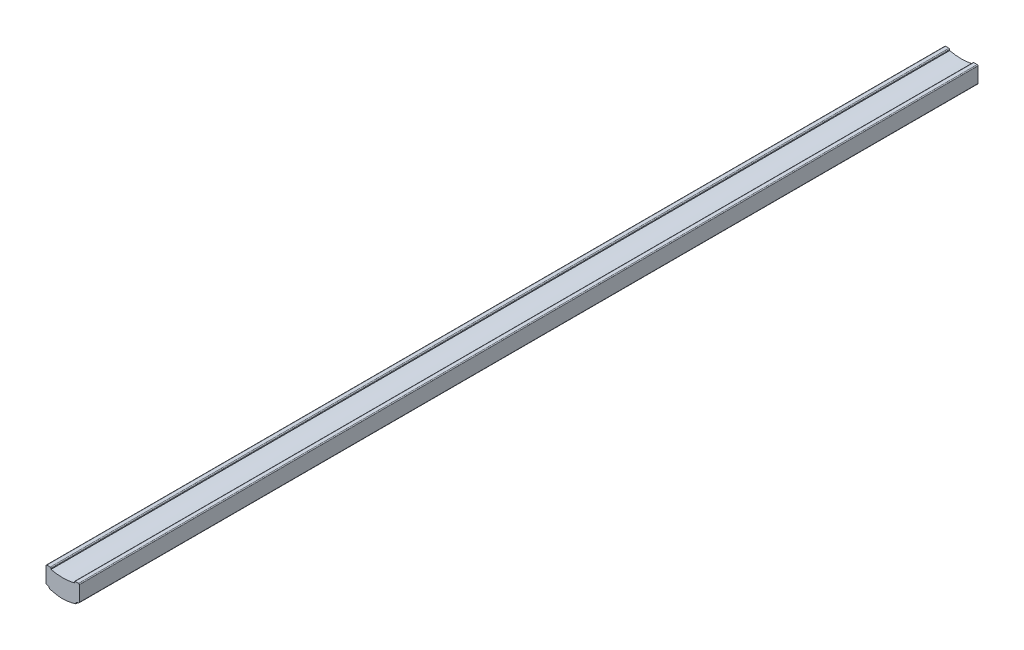
ISO-10303-21;
HEADER;
FILE_DESCRIPTION(('STEP AP214'),'2;1');
FILE_NAME('part.step','',(''),(''),'','','');
FILE_SCHEMA(('AUTOMOTIVE_DESIGN { 1 0 10303 214 1 1 1 1 }'));
ENDSEC;
DATA;
#1=APPLICATION_CONTEXT('core data for automotive mechanical design processes');
#2=APPLICATION_PROTOCOL_DEFINITION('international standard','automotive_design',2000,#1);
#3=PRODUCT_CONTEXT('',#1,'mechanical');
#4=PRODUCT('Part','Part','',(#3));
#5=PRODUCT_RELATED_PRODUCT_CATEGORY('part','',(#4));
#6=PRODUCT_DEFINITION_FORMATION('','',#4);
#7=PRODUCT_DEFINITION_CONTEXT('part definition',#1,'design');
#8=PRODUCT_DEFINITION('design','',#6,#7);
#9=PRODUCT_DEFINITION_SHAPE('','',#8);
#10=(LENGTH_UNIT() NAMED_UNIT(*) SI_UNIT(.MILLI.,.METRE.));
#11=(NAMED_UNIT(*) PLANE_ANGLE_UNIT() SI_UNIT($,.RADIAN.));
#12=(NAMED_UNIT(*) SI_UNIT($,.STERADIAN.) SOLID_ANGLE_UNIT());
#13=UNCERTAINTY_MEASURE_WITH_UNIT(LENGTH_MEASURE(1.E-05),#10,'distance_accuracy_value','');
#14=(GEOMETRIC_REPRESENTATION_CONTEXT(3) GLOBAL_UNCERTAINTY_ASSIGNED_CONTEXT((#13)) GLOBAL_UNIT_ASSIGNED_CONTEXT((#10,
#11,#12)) REPRESENTATION_CONTEXT('',''));
#15=CARTESIAN_POINT('',(0.,0.,0.));
#16=DIRECTION('',(0.,0.,1.));
#17=DIRECTION('',(1.,0.,0.));
#18=AXIS2_PLACEMENT_3D('',#15,#16,#17);
#19=CARTESIAN_POINT('',(3.26903594988043,0.,540.));
#20=DIRECTION('',(1.,0.,0.));
#21=DIRECTION('',(0.,0.,-1.));
#22=AXIS2_PLACEMENT_3D('',#19,#20,#21);
#23=PLANE('',#22);
#24=DIRECTION('',(0.,-1.,0.));
#25=VECTOR('',#24,1.);
#26=CARTESIAN_POINT('',(3.26903594988043,0.,0.));
#27=LINE('',#26,#25);
#28=CARTESIAN_POINT('',(3.26903594988043,11.1484454982522,0.));
#29=VERTEX_POINT('',#28);
#30=CARTESIAN_POINT('',(3.26903594988043,10.6484454982522,0.));
#31=VERTEX_POINT('',#30);
#32=EDGE_CURVE('E221',#29,#31,#27,.T.);
#33=ORIENTED_EDGE('',*,*,#32,.T.);
#34=DIRECTION('',(0.,0.,-1.));
#35=VECTOR('',#34,1.);
#36=CARTESIAN_POINT('',(3.26903594988043,10.6484454982522,540.));
#37=LINE('',#36,#35);
#38=CARTESIAN_POINT('',(3.26903594988043,10.6484454982522,540.));
#39=VERTEX_POINT('',#38);
#40=EDGE_CURVE('E11',#39,#31,#37,.T.);
#41=ORIENTED_EDGE('',*,*,#40,.F.);
#42=DIRECTION('',(0.,-1.,0.));
#43=VECTOR('',#42,1.);
#44=CARTESIAN_POINT('',(3.26903594988043,0.,540.));
#45=LINE('',#44,#43);
#46=CARTESIAN_POINT('',(3.26903594988043,11.1484454982522,540.));
#47=VERTEX_POINT('',#46);
#48=EDGE_CURVE('E283',#47,#39,#45,.T.);
#49=ORIENTED_EDGE('',*,*,#48,.F.);
#50=DIRECTION('',(0.,0.,-1.));
#51=VECTOR('',#50,1.);
#52=CARTESIAN_POINT('',(3.26903594988043,11.1484454982522,540.));
#53=LINE('',#52,#51);
#54=EDGE_CURVE('E217',#47,#29,#53,.T.);
#55=ORIENTED_EDGE('',*,*,#54,.T.);
#56=EDGE_LOOP('',(#33,#41,#49,#55));
#57=FACE_BOUND('',#56,.T.);
#58=ADVANCED_FACE('F36',(#57),#23,.F.);
#59=CARTESIAN_POINT('',(-3.73096405011958,39.8203497898818,540.));
#60=DIRECTION('',(0.,0.,-1.));
#61=DIRECTION('',(-1.,0.,0.));
#62=AXIS2_PLACEMENT_3D('',#59,#60,#61);
#63=CYLINDRICAL_SURFACE('',#62,30.);
#64=CARTESIAN_POINT('',(-3.73096405011958,39.8203497898818,0.));
#65=DIRECTION('',(0.,0.,1.));
#66=DIRECTION('',(1.,0.,0.));
#67=AXIS2_PLACEMENT_3D('',#64,#65,#66);
#68=CIRCLE('',#67,30.);
#69=CARTESIAN_POINT('',(-10.7309640501196,10.6484454982522,0.));
#70=VERTEX_POINT('',#69);
#71=EDGE_CURVE('E224',#31,#70,#68,.F.);
#72=ORIENTED_EDGE('',*,*,#71,.T.);
#73=DIRECTION('',(0.,0.,-1.));
#74=VECTOR('',#73,1.);
#75=CARTESIAN_POINT('',(-10.7309640501196,10.6484454982522,540.));
#76=LINE('',#75,#74);
#77=CARTESIAN_POINT('',(-10.7309640501196,10.6484454982522,540.));
#78=VERTEX_POINT('',#77);
#79=EDGE_CURVE('E44',#78,#70,#76,.T.);
#80=ORIENTED_EDGE('',*,*,#79,.F.);
#81=CARTESIAN_POINT('',(-3.73096405011958,39.8203497898818,540.));
#82=DIRECTION('',(0.,0.,1.));
#83=DIRECTION('',(1.,0.,0.));
#84=AXIS2_PLACEMENT_3D('',#81,#82,#83);
#85=CIRCLE('',#84,30.);
#86=EDGE_CURVE('E140',#39,#78,#85,.F.);
#87=ORIENTED_EDGE('',*,*,#86,.F.);
#88=ORIENTED_EDGE('',*,*,#40,.T.);
#89=EDGE_LOOP('',(#72,#80,#87,#88));
#90=FACE_BOUND('',#89,.T.);
#91=ADVANCED_FACE('F327',(#90),#63,.F.);
#92=CARTESIAN_POINT('',(-10.7309640501196,0.,540.));
#93=DIRECTION('',(1.,0.,0.));
#94=DIRECTION('',(0.,0.,-1.));
#95=AXIS2_PLACEMENT_3D('',#92,#93,#94);
#96=PLANE('',#95);
#97=DIRECTION('',(0.,-1.,0.));
#98=VECTOR('',#97,1.);
#99=CARTESIAN_POINT('',(-10.7309640501196,0.,0.));
#100=LINE('',#99,#98);
#101=CARTESIAN_POINT('',(-10.7309640501196,11.1484454982522,0.));
#102=VERTEX_POINT('',#101);
#103=EDGE_CURVE('E227',#102,#70,#100,.T.);
#104=ORIENTED_EDGE('',*,*,#103,.F.);
#105=DIRECTION('',(0.,0.,-1.));
#106=VECTOR('',#105,1.);
#107=CARTESIAN_POINT('',(-10.7309640501196,11.1484454982522,540.));
#108=LINE('',#107,#106);
#109=CARTESIAN_POINT('',(-10.7309640501196,11.1484454982522,540.));
#110=VERTEX_POINT('',#109);
#111=EDGE_CURVE('E320',#110,#102,#108,.T.);
#112=ORIENTED_EDGE('',*,*,#111,.F.);
#113=DIRECTION('',(0.,-1.,0.));
#114=VECTOR('',#113,1.);
#115=CARTESIAN_POINT('',(-10.7309640501196,0.,540.));
#116=LINE('',#115,#114);
#117=EDGE_CURVE('E326',#110,#78,#116,.T.);
#118=ORIENTED_EDGE('',*,*,#117,.T.);
#119=ORIENTED_EDGE('',*,*,#79,.T.);
#120=EDGE_LOOP('',(#104,#112,#118,#119));
#121=FACE_BOUND('',#120,.T.);
#122=ADVANCED_FACE('F324',(#121),#96,.T.);
#123=CARTESIAN_POINT('',(-11.2309640501196,11.1484454982522,540.));
#124=DIRECTION('',(0.,0.,-1.));
#125=DIRECTION('',(-1.,0.,0.));
#126=AXIS2_PLACEMENT_3D('',#123,#124,#125);
#127=CYLINDRICAL_SURFACE('',#126,0.5);
#128=CARTESIAN_POINT('',(-11.2309640501196,11.1484454982522,0.));
#129=DIRECTION('',(0.,0.,1.));
#130=DIRECTION('',(1.,0.,0.));
#131=AXIS2_PLACEMENT_3D('',#128,#129,#130);
#132=CIRCLE('',#131,0.5);
#133=CARTESIAN_POINT('',(-11.2309640501196,11.6484454982522,0.));
#134=VERTEX_POINT('',#133);
#135=EDGE_CURVE('E230',#134,#102,#132,.F.);
#136=ORIENTED_EDGE('',*,*,#135,.F.);
#137=DIRECTION('',(0.,0.,-1.));
#138=VECTOR('',#137,1.);
#139=CARTESIAN_POINT('',(-11.2309640501196,11.6484454982522,540.));
#140=LINE('',#139,#138);
#141=CARTESIAN_POINT('',(-11.2309640501196,11.6484454982522,540.));
#142=VERTEX_POINT('',#141);
#143=EDGE_CURVE('E318',#142,#134,#140,.T.);
#144=ORIENTED_EDGE('',*,*,#143,.F.);
#145=CARTESIAN_POINT('',(-11.2309640501196,11.1484454982522,540.));
#146=DIRECTION('',(0.,0.,1.));
#147=DIRECTION('',(1.,0.,0.));
#148=AXIS2_PLACEMENT_3D('',#145,#146,#147);
#149=CIRCLE('',#148,0.5);
#150=EDGE_CURVE('E338',#142,#110,#149,.F.);
#151=ORIENTED_EDGE('',*,*,#150,.T.);
#152=ORIENTED_EDGE('',*,*,#111,.T.);
#153=EDGE_LOOP('',(#136,#144,#151,#152));
#154=FACE_BOUND('',#153,.T.);
#155=ADVANCED_FACE('F335',(#154),#127,.T.);
#156=CARTESIAN_POINT('',(0.,11.6484454982521,540.));
#157=DIRECTION('',(0.,1.,0.));
#158=DIRECTION('',(-1.,0.,0.));
#159=AXIS2_PLACEMENT_3D('',#156,#157,#158);
#160=PLANE('',#159);
#161=DIRECTION('',(1.,0.,0.));
#162=VECTOR('',#161,1.);
#163=CARTESIAN_POINT('',(0.,11.6484454982521,0.));
#164=LINE('',#163,#162);
#165=CARTESIAN_POINT('',(-13.2309640501196,11.6484454982522,0.));
#166=VERTEX_POINT('',#165);
#167=EDGE_CURVE('E233',#166,#134,#164,.T.);
#168=ORIENTED_EDGE('',*,*,#167,.F.);
#169=DIRECTION('',(0.,0.,-1.));
#170=VECTOR('',#169,1.);
#171=CARTESIAN_POINT('',(-13.2309640501196,11.6484454982522,540.));
#172=LINE('',#171,#170);
#173=CARTESIAN_POINT('',(-13.2309640501196,11.6484454982522,540.));
#174=VERTEX_POINT('',#173);
#175=EDGE_CURVE('E316',#174,#166,#172,.T.);
#176=ORIENTED_EDGE('',*,*,#175,.F.);
#177=DIRECTION('',(1.,0.,0.));
#178=VECTOR('',#177,1.);
#179=CARTESIAN_POINT('',(0.,11.6484454982521,540.));
#180=LINE('',#179,#178);
#181=EDGE_CURVE('E342',#174,#142,#180,.T.);
#182=ORIENTED_EDGE('',*,*,#181,.T.);
#183=ORIENTED_EDGE('',*,*,#143,.T.);
#184=EDGE_LOOP('',(#168,#176,#182,#183));
#185=FACE_BOUND('',#184,.T.);
#186=ADVANCED_FACE('F410',(#185),#160,.T.);
#187=CARTESIAN_POINT('',(-13.2309640501196,11.1484454982522,540.));
#188=DIRECTION('',(0.,0.,-1.));
#189=DIRECTION('',(-1.,0.,0.));
#190=AXIS2_PLACEMENT_3D('',#187,#188,#189);
#191=CYLINDRICAL_SURFACE('',#190,0.5);
#192=CARTESIAN_POINT('',(-13.2309640501196,11.1484454982522,0.));
#193=DIRECTION('',(0.,0.,1.));
#194=DIRECTION('',(1.,0.,0.));
#195=AXIS2_PLACEMENT_3D('',#192,#193,#194);
#196=CIRCLE('',#195,0.5);
#197=CARTESIAN_POINT('',(-13.7309640501196,11.1484454982522,0.));
#198=VERTEX_POINT('',#197);
#199=EDGE_CURVE('E236',#198,#166,#196,.F.);
#200=ORIENTED_EDGE('',*,*,#199,.F.);
#201=DIRECTION('',(0.,0.,-1.));
#202=VECTOR('',#201,1.);
#203=CARTESIAN_POINT('',(-13.7309640501196,11.1484454982522,540.));
#204=LINE('',#203,#202);
#205=CARTESIAN_POINT('',(-13.7309640501196,11.1484454982522,540.));
#206=VERTEX_POINT('',#205);
#207=EDGE_CURVE('E314',#206,#198,#204,.T.);
#208=ORIENTED_EDGE('',*,*,#207,.F.);
#209=CARTESIAN_POINT('',(-13.2309640501196,11.1484454982522,540.));
#210=DIRECTION('',(0.,0.,1.));
#211=DIRECTION('',(1.,0.,0.));
#212=AXIS2_PLACEMENT_3D('',#209,#210,#211);
#213=CIRCLE('',#212,0.5);
#214=EDGE_CURVE('E348',#206,#174,#213,.F.);
#215=ORIENTED_EDGE('',*,*,#214,.T.);
#216=ORIENTED_EDGE('',*,*,#175,.T.);
#217=EDGE_LOOP('',(#200,#208,#215,#216));
#218=FACE_BOUND('',#217,.T.);
#219=ADVANCED_FACE('F413',(#218),#191,.T.);
#220=CARTESIAN_POINT('',(-13.7309640501196,0.,540.));
#221=DIRECTION('',(1.,0.,0.));
#222=DIRECTION('',(0.,0.,-1.));
#223=AXIS2_PLACEMENT_3D('',#220,#221,#222);
#224=PLANE('',#223);
#225=DIRECTION('',(0.,-1.,0.));
#226=VECTOR('',#225,1.);
#227=CARTESIAN_POINT('',(-13.7309640501196,0.,0.));
#228=LINE('',#227,#226);
#229=CARTESIAN_POINT('',(-13.7309640501196,2.0356584121908,0.));
#230=VERTEX_POINT('',#229);
#231=EDGE_CURVE('E239',#198,#230,#228,.T.);
#232=ORIENTED_EDGE('',*,*,#231,.T.);
#233=DIRECTION('',(0.,0.,-1.));
#234=VECTOR('',#233,1.);
#235=CARTESIAN_POINT('',(-13.7309640501196,2.0356584121908,540.));
#236=LINE('',#235,#234);
#237=CARTESIAN_POINT('',(-13.7309640501196,2.0356584121908,540.));
#238=VERTEX_POINT('',#237);
#239=EDGE_CURVE('E312',#238,#230,#236,.T.);
#240=ORIENTED_EDGE('',*,*,#239,.F.);
#241=DIRECTION('',(0.,-1.,0.));
#242=VECTOR('',#241,1.);
#243=CARTESIAN_POINT('',(-13.7309640501196,0.,540.));
#244=LINE('',#243,#242);
#245=EDGE_CURVE('E351',#206,#238,#244,.T.);
#246=ORIENTED_EDGE('',*,*,#245,.F.);
#247=ORIENTED_EDGE('',*,*,#207,.T.);
#248=EDGE_LOOP('',(#232,#240,#246,#247));
#249=FACE_BOUND('',#248,.T.);
#250=ADVANCED_FACE('F417',(#249),#224,.F.);
#251=CARTESIAN_POINT('',(-13.2309640501196,2.03565841219079,540.));
#252=DIRECTION('',(0.,0.,-1.));
#253=DIRECTION('',(-1.,0.,0.));
#254=AXIS2_PLACEMENT_3D('',#251,#252,#253);
#255=CYLINDRICAL_SURFACE('',#254,0.5);
#256=CARTESIAN_POINT('',(-13.2309640501196,2.03565841219079,0.));
#257=DIRECTION('',(0.,0.,1.));
#258=DIRECTION('',(1.,0.,0.));
#259=AXIS2_PLACEMENT_3D('',#256,#257,#258);
#260=CIRCLE('',#259,0.5);
#261=CARTESIAN_POINT('',(-13.3560674410939,1.55156220112659,0.));
#262=VERTEX_POINT('',#261);
#263=EDGE_CURVE('E242',#262,#230,#260,.F.);
#264=ORIENTED_EDGE('',*,*,#263,.F.);
#265=DIRECTION('',(0.,0.,-1.));
#266=VECTOR('',#265,1.);
#267=CARTESIAN_POINT('',(-13.3560674410939,1.55156220112659,540.));
#268=LINE('',#267,#266);
#269=CARTESIAN_POINT('',(-13.3560674410939,1.55156220112659,540.));
#270=VERTEX_POINT('',#269);
#271=EDGE_CURVE('E310',#270,#262,#268,.T.);
#272=ORIENTED_EDGE('',*,*,#271,.F.);
#273=CARTESIAN_POINT('',(-13.2309640501196,2.03565841219079,540.));
#274=DIRECTION('',(0.,0.,1.));
#275=DIRECTION('',(1.,0.,0.));
#276=AXIS2_PLACEMENT_3D('',#273,#274,#275);
#277=CIRCLE('',#276,0.5);
#278=EDGE_CURVE('E353',#270,#238,#277,.F.);
#279=ORIENTED_EDGE('',*,*,#278,.T.);
#280=ORIENTED_EDGE('',*,*,#239,.T.);
#281=EDGE_LOOP('',(#264,#272,#279,#280));
#282=FACE_BOUND('',#281,.T.);
#283=ADVANCED_FACE('F421',(#282),#255,.T.);
#284=CARTESIAN_POINT('',(-0.46027236151639,-1.78105568947626,540.));
#285=DIRECTION('',(0.25020678194872,0.968192422128404,0.));
#286=DIRECTION('',(-0.968192422128404,0.25020678194872,0.));
#287=AXIS2_PLACEMENT_3D('',#284,#285,#286);
#288=PLANE('',#287);
#289=DIRECTION('',(0.968192422128404,-0.25020678194872,0.));
#290=VECTOR('',#289,1.);
#291=CARTESIAN_POINT('',(-0.46027236151639,-1.78105568947626,0.));
#292=LINE('',#291,#290);
#293=CARTESIAN_POINT('',(-12.1694758148884,1.24491523148029,0.));
#294=VERTEX_POINT('',#293);
#295=EDGE_CURVE('E245',#262,#294,#292,.T.);
#296=ORIENTED_EDGE('',*,*,#295,.T.);
#297=DIRECTION('',(0.,0.,-1.));
#298=VECTOR('',#297,1.);
#299=CARTESIAN_POINT('',(-12.1694758148884,1.24491523148029,540.));
#300=LINE('',#299,#298);
#301=CARTESIAN_POINT('',(-12.1694758148884,1.24491523148029,540.));
#302=VERTEX_POINT('',#301);
#303=EDGE_CURVE('E308',#302,#294,#300,.T.);
#304=ORIENTED_EDGE('',*,*,#303,.F.);
#305=DIRECTION('',(0.968192422128404,-0.25020678194872,0.));
#306=VECTOR('',#305,1.);
#307=CARTESIAN_POINT('',(-0.46027236151639,-1.78105568947626,540.));
#308=LINE('',#307,#306);
#309=EDGE_CURVE('E356',#270,#302,#308,.T.);
#310=ORIENTED_EDGE('',*,*,#309,.F.);
#311=ORIENTED_EDGE('',*,*,#271,.T.);
#312=EDGE_LOOP('',(#296,#304,#310,#311));
#313=FACE_BOUND('',#312,.T.);
#314=ADVANCED_FACE('F425',(#313),#288,.F.);
#315=CARTESIAN_POINT('',(-12.2945792058628,0.760819020416091,540.));
#316=DIRECTION('',(0.,0.,-1.));
#317=DIRECTION('',(-1.,0.,0.));
#318=AXIS2_PLACEMENT_3D('',#315,#316,#317);
#319=CYLINDRICAL_SURFACE('',#318,0.5);
#320=CARTESIAN_POINT('',(-12.2945792058628,0.760819020416091,0.));
#321=DIRECTION('',(0.,0.,1.));
#322=DIRECTION('',(1.,0.,0.));
#323=AXIS2_PLACEMENT_3D('',#320,#321,#322);
#324=CIRCLE('',#323,0.5);
#325=CARTESIAN_POINT('',(-11.7945792058628,0.76081902041609,0.));
#326=VERTEX_POINT('',#325);
#327=EDGE_CURVE('E248',#326,#294,#324,.T.);
#328=ORIENTED_EDGE('',*,*,#327,.F.);
#329=DIRECTION('',(0.,0.,-1.));
#330=VECTOR('',#329,1.);
#331=CARTESIAN_POINT('',(-11.7945792058628,0.76081902041609,540.));
#332=LINE('',#331,#330);
#333=CARTESIAN_POINT('',(-11.7945792058628,0.76081902041609,540.));
#334=VERTEX_POINT('',#333);
#335=EDGE_CURVE('E306',#334,#326,#332,.T.);
#336=ORIENTED_EDGE('',*,*,#335,.F.);
#337=CARTESIAN_POINT('',(-12.2945792058628,0.760819020416091,540.));
#338=DIRECTION('',(0.,0.,1.));
#339=DIRECTION('',(1.,0.,0.));
#340=AXIS2_PLACEMENT_3D('',#337,#338,#339);
#341=CIRCLE('',#340,0.5);
#342=EDGE_CURVE('E358',#334,#302,#341,.T.);
#343=ORIENTED_EDGE('',*,*,#342,.T.);
#344=ORIENTED_EDGE('',*,*,#303,.T.);
#345=EDGE_LOOP('',(#328,#336,#343,#344));
#346=FACE_BOUND('',#345,.T.);
#347=ADVANCED_FACE('F429',(#346),#319,.F.);
#348=CARTESIAN_POINT('',(-11.7945792058628,0.,540.));
#349=DIRECTION('',(1.,0.,0.));
#350=DIRECTION('',(0.,0.,-1.));
#351=AXIS2_PLACEMENT_3D('',#348,#349,#350);
#352=PLANE('',#351);
#353=DIRECTION('',(0.,-1.,0.));
#354=VECTOR('',#353,1.);
#355=CARTESIAN_POINT('',(-11.7945792058628,0.,0.));
#356=LINE('',#355,#354);
#357=CARTESIAN_POINT('',(-11.7945792058628,0.442917518155099,0.));
#358=VERTEX_POINT('',#357);
#359=EDGE_CURVE('E251',#326,#358,#356,.T.);
#360=ORIENTED_EDGE('',*,*,#359,.T.);
#361=DIRECTION('',(0.,0.,-1.));
#362=VECTOR('',#361,1.);
#363=CARTESIAN_POINT('',(-11.7945792058628,0.442917518155099,540.));
#364=LINE('',#363,#362);
#365=CARTESIAN_POINT('',(-11.7945792058628,0.442917518155099,540.));
#366=VERTEX_POINT('',#365);
#367=EDGE_CURVE('E304',#366,#358,#364,.T.);
#368=ORIENTED_EDGE('',*,*,#367,.F.);
#369=DIRECTION('',(0.,-1.,0.));
#370=VECTOR('',#369,1.);
#371=CARTESIAN_POINT('',(-11.7945792058628,0.,540.));
#372=LINE('',#371,#370);
#373=EDGE_CURVE('E361',#334,#366,#372,.T.);
#374=ORIENTED_EDGE('',*,*,#373,.F.);
#375=ORIENTED_EDGE('',*,*,#335,.T.);
#376=EDGE_LOOP('',(#360,#368,#374,#375));
#377=FACE_BOUND('',#376,.T.);
#378=ADVANCED_FACE('F433',(#377),#352,.F.);
#379=CARTESIAN_POINT('',(-11.4945792058628,0.442917518155099,540.));
#380=DIRECTION('',(0.,0.,-1.));
#381=DIRECTION('',(-1.,0.,0.));
#382=AXIS2_PLACEMENT_3D('',#379,#380,#381);
#383=CYLINDRICAL_SURFACE('',#382,0.300000000000003);
#384=CARTESIAN_POINT('',(-11.4945792058628,0.442917518155099,0.));
#385=DIRECTION('',(0.,0.,1.));
#386=DIRECTION('',(1.,0.,0.));
#387=AXIS2_PLACEMENT_3D('',#384,#385,#386);
#388=CIRCLE('',#387,0.300000000000003);
#389=CARTESIAN_POINT('',(-11.5837182319338,0.156466415816313,0.));
#390=VERTEX_POINT('',#389);
#391=EDGE_CURVE('E254',#390,#358,#388,.F.);
#392=ORIENTED_EDGE('',*,*,#391,.F.);
#393=DIRECTION('',(0.,0.,-1.));
#394=VECTOR('',#393,1.);
#395=CARTESIAN_POINT('',(-11.5837182319338,0.156466415816313,540.));
#396=LINE('',#395,#394);
#397=CARTESIAN_POINT('',(-11.5837182319338,0.156466415816313,540.));
#398=VERTEX_POINT('',#397);
#399=EDGE_CURVE('E302',#398,#390,#396,.T.);
#400=ORIENTED_EDGE('',*,*,#399,.F.);
#401=CARTESIAN_POINT('',(-11.4945792058628,0.442917518155099,540.));
#402=DIRECTION('',(0.,0.,1.));
#403=DIRECTION('',(1.,0.,0.));
#404=AXIS2_PLACEMENT_3D('',#401,#402,#403);
#405=CIRCLE('',#404,0.300000000000003);
#406=EDGE_CURVE('E363',#398,#366,#405,.F.);
#407=ORIENTED_EDGE('',*,*,#406,.T.);
#408=ORIENTED_EDGE('',*,*,#367,.T.);
#409=EDGE_LOOP('',(#392,#400,#407,#408));
#410=FACE_BOUND('',#409,.T.);
#411=ADVANCED_FACE('F437',(#410),#383,.T.);
#412=CARTESIAN_POINT('',(-2.66981562482485,28.8015766496935,540.));
#413=DIRECTION('',(0.,0.,-1.));
#414=DIRECTION('',(-1.,0.,0.));
#415=AXIS2_PLACEMENT_3D('',#412,#413,#414);
#416=CYLINDRICAL_SURFACE('',#415,30.);
#417=CARTESIAN_POINT('',(-2.66981562482485,28.8015766496935,0.));
#418=DIRECTION('',(0.,0.,1.));
#419=DIRECTION('',(1.,0.,0.));
#420=AXIS2_PLACEMENT_3D('',#417,#418,#419);
#421=CIRCLE('',#420,30.);
#422=CARTESIAN_POINT('',(-3.73096405011957,-1.1796502101182,0.));
#423=VERTEX_POINT('',#422);
#424=EDGE_CURVE('E257',#423,#390,#421,.F.);
#425=ORIENTED_EDGE('',*,*,#424,.F.);
#426=DIRECTION('',(0.,0.,-1.));
#427=VECTOR('',#426,1.);
#428=CARTESIAN_POINT('',(-3.73096405011957,-1.1796502101182,540.));
#429=LINE('',#428,#427);
#430=CARTESIAN_POINT('',(-3.73096405011957,-1.1796502101182,540.));
#431=VERTEX_POINT('',#430);
#432=EDGE_CURVE('E300',#431,#423,#429,.T.);
#433=ORIENTED_EDGE('',*,*,#432,.F.);
#434=CARTESIAN_POINT('',(-2.66981562482485,28.8015766496935,540.));
#435=DIRECTION('',(0.,0.,1.));
#436=DIRECTION('',(1.,0.,0.));
#437=AXIS2_PLACEMENT_3D('',#434,#435,#436);
#438=CIRCLE('',#437,30.);
#439=EDGE_CURVE('E366',#431,#398,#438,.F.);
#440=ORIENTED_EDGE('',*,*,#439,.T.);
#441=ORIENTED_EDGE('',*,*,#399,.T.);
#442=EDGE_LOOP('',(#425,#433,#440,#441));
#443=FACE_BOUND('',#442,.T.);
#444=ADVANCED_FACE('F441',(#443),#416,.T.);
#445=CARTESIAN_POINT('',(-4.79211247541431,28.8015766496935,540.));
#446=DIRECTION('',(0.,0.,-1.));
#447=DIRECTION('',(-1.,0.,0.));
#448=AXIS2_PLACEMENT_3D('',#445,#446,#447);
#449=CYLINDRICAL_SURFACE('',#448,30.);
#450=CARTESIAN_POINT('',(-4.79211247541431,28.8015766496935,0.));
#451=DIRECTION('',(0.,0.,1.));
#452=DIRECTION('',(1.,0.,0.));
#453=AXIS2_PLACEMENT_3D('',#450,#451,#452);
#454=CIRCLE('',#453,30.);
#455=CARTESIAN_POINT('',(4.12179013169471,0.156466415816327,0.));
#456=VERTEX_POINT('',#455);
#457=EDGE_CURVE('E260',#423,#456,#454,.T.);
#458=ORIENTED_EDGE('',*,*,#457,.T.);
#459=DIRECTION('',(0.,0.,-1.));
#460=VECTOR('',#459,1.);
#461=CARTESIAN_POINT('',(4.12179013169471,0.156466415816327,540.));
#462=LINE('',#461,#460);
#463=CARTESIAN_POINT('',(4.12179013169471,0.156466415816327,540.));
#464=VERTEX_POINT('',#463);
#465=EDGE_CURVE('E297',#464,#456,#462,.T.);
#466=ORIENTED_EDGE('',*,*,#465,.F.);
#467=CARTESIAN_POINT('',(-4.79211247541431,28.8015766496935,540.));
#468=DIRECTION('',(0.,0.,1.));
#469=DIRECTION('',(1.,0.,0.));
#470=AXIS2_PLACEMENT_3D('',#467,#468,#469);
#471=CIRCLE('',#470,30.);
#472=EDGE_CURVE('E369',#431,#464,#471,.T.);
#473=ORIENTED_EDGE('',*,*,#472,.F.);
#474=ORIENTED_EDGE('',*,*,#432,.T.);
#475=EDGE_LOOP('',(#458,#466,#473,#474));
#476=FACE_BOUND('',#475,.T.);
#477=ADVANCED_FACE('F445',(#476),#449,.T.);
#478=CARTESIAN_POINT('',(4.03265110562362,0.442917518155102,540.));
#479=DIRECTION('',(0.,0.,-1.));
#480=DIRECTION('',(-1.,0.,0.));
#481=AXIS2_PLACEMENT_3D('',#478,#479,#480);
#482=CYLINDRICAL_SURFACE('',#481,0.300000000000003);
#483=CARTESIAN_POINT('',(4.03265110562362,0.442917518155102,0.));
#484=DIRECTION('',(0.,0.,1.));
#485=DIRECTION('',(1.,0.,0.));
#486=AXIS2_PLACEMENT_3D('',#483,#484,#485);
#487=CIRCLE('',#486,0.300000000000003);
#488=CARTESIAN_POINT('',(4.33265110562362,0.442917518155102,0.));
#489=VERTEX_POINT('',#488);
#490=EDGE_CURVE('E262',#456,#489,#487,.T.);
#491=ORIENTED_EDGE('',*,*,#490,.T.);
#492=DIRECTION('',(0.,0.,-1.));
#493=VECTOR('',#492,1.);
#494=CARTESIAN_POINT('',(4.33265110562362,0.442917518155102,540.));
#495=LINE('',#494,#493);
#496=CARTESIAN_POINT('',(4.33265110562362,0.442917518155102,540.));
#497=VERTEX_POINT('',#496);
#498=EDGE_CURVE('E295',#497,#489,#495,.T.);
#499=ORIENTED_EDGE('',*,*,#498,.F.);
#500=CARTESIAN_POINT('',(4.03265110562362,0.442917518155102,540.));
#501=DIRECTION('',(0.,0.,1.));
#502=DIRECTION('',(1.,0.,0.));
#503=AXIS2_PLACEMENT_3D('',#500,#501,#502);
#504=CIRCLE('',#503,0.300000000000003);
#505=EDGE_CURVE('E371',#464,#497,#504,.T.);
#506=ORIENTED_EDGE('',*,*,#505,.F.);
#507=ORIENTED_EDGE('',*,*,#465,.T.);
#508=EDGE_LOOP('',(#491,#499,#506,#507));
#509=FACE_BOUND('',#508,.T.);
#510=ADVANCED_FACE('F449',(#509),#482,.T.);
#511=CARTESIAN_POINT('',(4.33265110562362,0.,540.));
#512=DIRECTION('',(1.,0.,0.));
#513=DIRECTION('',(0.,0.,-1.));
#514=AXIS2_PLACEMENT_3D('',#511,#512,#513);
#515=PLANE('',#514);
#516=DIRECTION('',(0.,-1.,0.));
#517=VECTOR('',#516,1.);
#518=CARTESIAN_POINT('',(4.33265110562362,0.,0.));
#519=LINE('',#518,#517);
#520=CARTESIAN_POINT('',(4.33265110562362,0.760819020416093,0.));
#521=VERTEX_POINT('',#520);
#522=EDGE_CURVE('E265',#521,#489,#519,.T.);
#523=ORIENTED_EDGE('',*,*,#522,.F.);
#524=DIRECTION('',(0.,0.,-1.));
#525=VECTOR('',#524,1.);
#526=CARTESIAN_POINT('',(4.33265110562362,0.760819020416093,540.));
#527=LINE('',#526,#525);
#528=CARTESIAN_POINT('',(4.33265110562362,0.760819020416093,540.));
#529=VERTEX_POINT('',#528);
#530=EDGE_CURVE('E293',#529,#521,#527,.T.);
#531=ORIENTED_EDGE('',*,*,#530,.F.);
#532=DIRECTION('',(0.,-1.,0.));
#533=VECTOR('',#532,1.);
#534=CARTESIAN_POINT('',(4.33265110562362,0.,540.));
#535=LINE('',#534,#533);
#536=EDGE_CURVE('E373',#529,#497,#535,.T.);
#537=ORIENTED_EDGE('',*,*,#536,.T.);
#538=ORIENTED_EDGE('',*,*,#498,.T.);
#539=EDGE_LOOP('',(#523,#531,#537,#538));
#540=FACE_BOUND('',#539,.T.);
#541=ADVANCED_FACE('F453',(#540),#515,.T.);
#542=CARTESIAN_POINT('',(4.83265110562362,0.760819020416095,540.));
#543=DIRECTION('',(0.,0.,-1.));
#544=DIRECTION('',(-1.,0.,0.));
#545=AXIS2_PLACEMENT_3D('',#542,#543,#544);
#546=CYLINDRICAL_SURFACE('',#545,0.5);
#547=CARTESIAN_POINT('',(4.83265110562362,0.760819020416095,0.));
#548=DIRECTION('',(0.,0.,1.));
#549=DIRECTION('',(1.,0.,0.));
#550=AXIS2_PLACEMENT_3D('',#547,#548,#549);
#551=CIRCLE('',#550,0.5);
#552=CARTESIAN_POINT('',(4.70754771464926,1.2449152314803,0.));
#553=VERTEX_POINT('',#552);
#554=EDGE_CURVE('E268',#521,#553,#551,.F.);
#555=ORIENTED_EDGE('',*,*,#554,.T.);
#556=DIRECTION('',(0.,0.,-1.));
#557=VECTOR('',#556,1.);
#558=CARTESIAN_POINT('',(4.70754771464926,1.2449152314803,540.));
#559=LINE('',#558,#557);
#560=CARTESIAN_POINT('',(4.70754771464926,1.2449152314803,540.));
#561=VERTEX_POINT('',#560);
#562=EDGE_CURVE('E291',#561,#553,#559,.T.);
#563=ORIENTED_EDGE('',*,*,#562,.F.);
#564=CARTESIAN_POINT('',(4.83265110562362,0.760819020416095,540.));
#565=DIRECTION('',(0.,0.,1.));
#566=DIRECTION('',(1.,0.,0.));
#567=AXIS2_PLACEMENT_3D('',#564,#565,#566);
#568=CIRCLE('',#567,0.5);
#569=EDGE_CURVE('E376',#529,#561,#568,.F.);
#570=ORIENTED_EDGE('',*,*,#569,.F.);
#571=ORIENTED_EDGE('',*,*,#530,.T.);
#572=EDGE_LOOP('',(#555,#563,#570,#571));
#573=FACE_BOUND('',#572,.T.);
#574=ADVANCED_FACE('F457',(#573),#546,.F.);
#575=CARTESIAN_POINT('',(-0.00686995982834381,0.0265837839978784,540.));
#576=DIRECTION('',(0.25020678194872,-0.968192422128404,0.));
#577=DIRECTION('',(0.968192422128404,0.25020678194872,0.));
#578=AXIS2_PLACEMENT_3D('',#575,#576,#577);
#579=PLANE('',#578);
#580=DIRECTION('',(-0.968192422128404,-0.25020678194872,0.));
#581=VECTOR('',#580,1.);
#582=CARTESIAN_POINT('',(-0.00686995982834381,0.0265837839978784,0.));
#583=LINE('',#582,#581);
#584=CARTESIAN_POINT('',(5.89413934085478,1.55156220112659,0.));
#585=VERTEX_POINT('',#584);
#586=EDGE_CURVE('E271',#585,#553,#583,.T.);
#587=ORIENTED_EDGE('',*,*,#586,.F.);
#588=DIRECTION('',(0.,0.,-1.));
#589=VECTOR('',#588,1.);
#590=CARTESIAN_POINT('',(5.89413934085478,1.55156220112659,540.));
#591=LINE('',#590,#589);
#592=CARTESIAN_POINT('',(5.89413934085478,1.55156220112659,540.));
#593=VERTEX_POINT('',#592);
#594=EDGE_CURVE('E289',#593,#585,#591,.T.);
#595=ORIENTED_EDGE('',*,*,#594,.F.);
#596=DIRECTION('',(-0.968192422128404,-0.25020678194872,0.));
#597=VECTOR('',#596,1.);
#598=CARTESIAN_POINT('',(-0.00686995982834381,0.0265837839978784,540.));
#599=LINE('',#598,#597);
#600=EDGE_CURVE('E378',#593,#561,#599,.T.);
#601=ORIENTED_EDGE('',*,*,#600,.T.);
#602=ORIENTED_EDGE('',*,*,#562,.T.);
#603=EDGE_LOOP('',(#587,#595,#601,#602));
#604=FACE_BOUND('',#603,.T.);
#605=ADVANCED_FACE('F461',(#604),#579,.T.);
#606=CARTESIAN_POINT('',(5.76903594988043,2.0356584121908,540.));
#607=DIRECTION('',(0.,0.,-1.));
#608=DIRECTION('',(-1.,0.,0.));
#609=AXIS2_PLACEMENT_3D('',#606,#607,#608);
#610=CYLINDRICAL_SURFACE('',#609,0.5);
#611=CARTESIAN_POINT('',(5.76903594988043,2.0356584121908,0.));
#612=DIRECTION('',(0.,0.,1.));
#613=DIRECTION('',(1.,0.,0.));
#614=AXIS2_PLACEMENT_3D('',#611,#612,#613);
#615=CIRCLE('',#614,0.5);
#616=CARTESIAN_POINT('',(6.26903594988043,2.0356584121908,0.));
#617=VERTEX_POINT('',#616);
#618=EDGE_CURVE('E274',#585,#617,#615,.T.);
#619=ORIENTED_EDGE('',*,*,#618,.T.);
#620=DIRECTION('',(0.,0.,-1.));
#621=VECTOR('',#620,1.);
#622=CARTESIAN_POINT('',(6.26903594988043,2.0356584121908,540.));
#623=LINE('',#622,#621);
#624=CARTESIAN_POINT('',(6.26903594988043,2.0356584121908,540.));
#625=VERTEX_POINT('',#624);
#626=EDGE_CURVE('E287',#625,#617,#623,.T.);
#627=ORIENTED_EDGE('',*,*,#626,.F.);
#628=CARTESIAN_POINT('',(5.76903594988043,2.0356584121908,540.));
#629=DIRECTION('',(0.,0.,1.));
#630=DIRECTION('',(1.,0.,0.));
#631=AXIS2_PLACEMENT_3D('',#628,#629,#630);
#632=CIRCLE('',#631,0.5);
#633=EDGE_CURVE('E381',#593,#625,#632,.T.);
#634=ORIENTED_EDGE('',*,*,#633,.F.);
#635=ORIENTED_EDGE('',*,*,#594,.T.);
#636=EDGE_LOOP('',(#619,#627,#634,#635));
#637=FACE_BOUND('',#636,.T.);
#638=ADVANCED_FACE('F465',(#637),#610,.T.);
#639=CARTESIAN_POINT('',(6.26903594988043,0.,540.));
#640=DIRECTION('',(1.,0.,0.));
#641=DIRECTION('',(0.,1.,0.));
#642=AXIS2_PLACEMENT_3D('',#639,#640,#641);
#643=PLANE('',#642);
#644=DIRECTION('',(0.,-1.,0.));
#645=VECTOR('',#644,1.);
#646=CARTESIAN_POINT('',(6.26903594988043,0.,0.));
#647=LINE('',#646,#645);
#648=CARTESIAN_POINT('',(6.26903594988042,11.1484454982522,0.));
#649=VERTEX_POINT('',#648);
#650=EDGE_CURVE('E277',#649,#617,#647,.T.);
#651=ORIENTED_EDGE('',*,*,#650,.F.);
#652=DIRECTION('',(0.,0.,-1.));
#653=VECTOR('',#652,1.);
#654=CARTESIAN_POINT('',(6.26903594988042,11.1484454982522,540.));
#655=LINE('',#654,#653);
#656=CARTESIAN_POINT('',(6.26903594988042,11.1484454982522,540.));
#657=VERTEX_POINT('',#656);
#658=EDGE_CURVE('E212',#657,#649,#655,.T.);
#659=ORIENTED_EDGE('',*,*,#658,.F.);
#660=DIRECTION('',(0.,-1.,0.));
#661=VECTOR('',#660,1.);
#662=CARTESIAN_POINT('',(6.26903594988043,0.,540.));
#663=LINE('',#662,#661);
#664=EDGE_CURVE('E205',#657,#625,#663,.T.);
#665=ORIENTED_EDGE('',*,*,#664,.T.);
#666=ORIENTED_EDGE('',*,*,#626,.T.);
#667=EDGE_LOOP('',(#651,#659,#665,#666));
#668=FACE_BOUND('',#667,.T.);
#669=ADVANCED_FACE('F384',(#668),#643,.T.);
#670=CARTESIAN_POINT('',(5.76903594988042,11.1484454982522,540.));
#671=DIRECTION('',(0.,0.,-1.));
#672=DIRECTION('',(-1.,0.,0.));
#673=AXIS2_PLACEMENT_3D('',#670,#671,#672);
#674=CYLINDRICAL_SURFACE('',#673,0.500000000000001);
#675=CARTESIAN_POINT('',(5.76903594988042,11.1484454982522,0.));
#676=DIRECTION('',(0.,0.,1.));
#677=DIRECTION('',(1.,0.,0.));
#678=AXIS2_PLACEMENT_3D('',#675,#676,#677);
#679=CIRCLE('',#678,0.500000000000001);
#680=CARTESIAN_POINT('',(5.76903594988042,11.6484454982522,0.));
#681=VERTEX_POINT('',#680);
#682=EDGE_CURVE('E211',#649,#681,#679,.T.);
#683=ORIENTED_EDGE('',*,*,#682,.T.);
#684=DIRECTION('',(0.,0.,-1.));
#685=VECTOR('',#684,1.);
#686=CARTESIAN_POINT('',(5.76903594988042,11.6484454982522,540.));
#687=LINE('',#686,#685);
#688=CARTESIAN_POINT('',(5.76903594988042,11.6484454982522,540.));
#689=VERTEX_POINT('',#688);
#690=EDGE_CURVE('E208',#689,#681,#687,.T.);
#691=ORIENTED_EDGE('',*,*,#690,.F.);
#692=CARTESIAN_POINT('',(5.76903594988042,11.1484454982522,540.));
#693=DIRECTION('',(0.,0.,1.));
#694=DIRECTION('',(1.,0.,0.));
#695=AXIS2_PLACEMENT_3D('',#692,#693,#694);
#696=CIRCLE('',#695,0.500000000000001);
#697=EDGE_CURVE('E199',#657,#689,#696,.T.);
#698=ORIENTED_EDGE('',*,*,#697,.F.);
#699=ORIENTED_EDGE('',*,*,#658,.T.);
#700=EDGE_LOOP('',(#683,#691,#698,#699));
#701=FACE_BOUND('',#700,.T.);
#702=ADVANCED_FACE('F209',(#701),#674,.T.);
#703=CARTESIAN_POINT('',(0.,11.6484454982522,540.));
#704=DIRECTION('',(0.,-1.,0.));
#705=DIRECTION('',(1.,0.,0.));
#706=AXIS2_PLACEMENT_3D('',#703,#704,#705);
#707=PLANE('',#706);
#708=DIRECTION('',(-1.,0.,0.));
#709=VECTOR('',#708,1.);
#710=CARTESIAN_POINT('',(0.,11.6484454982522,0.));
#711=LINE('',#710,#709);
#712=CARTESIAN_POINT('',(3.76903594988043,11.6484454982522,0.));
#713=VERTEX_POINT('',#712);
#714=EDGE_CURVE('E126',#681,#713,#711,.T.);
#715=ORIENTED_EDGE('',*,*,#714,.T.);
#716=DIRECTION('',(0.,0.,-1.));
#717=VECTOR('',#716,1.);
#718=CARTESIAN_POINT('',(3.76903594988043,11.6484454982522,540.));
#719=LINE('',#718,#717);
#720=CARTESIAN_POINT('',(3.76903594988043,11.6484454982522,540.));
#721=VERTEX_POINT('',#720);
#722=EDGE_CURVE('E213',#721,#713,#719,.T.);
#723=ORIENTED_EDGE('',*,*,#722,.F.);
#724=DIRECTION('',(-1.,0.,0.));
#725=VECTOR('',#724,1.);
#726=CARTESIAN_POINT('',(0.,11.6484454982522,540.));
#727=LINE('',#726,#725);
#728=EDGE_CURVE('E203',#689,#721,#727,.T.);
#729=ORIENTED_EDGE('',*,*,#728,.F.);
#730=ORIENTED_EDGE('',*,*,#690,.T.);
#731=EDGE_LOOP('',(#715,#723,#729,#730));
#732=FACE_BOUND('',#731,.T.);
#733=ADVANCED_FACE('F215',(#732),#707,.F.);
#734=CARTESIAN_POINT('',(3.76903594988043,11.1484454982522,540.));
#735=DIRECTION('',(0.,0.,-1.));
#736=DIRECTION('',(-1.,0.,0.));
#737=AXIS2_PLACEMENT_3D('',#734,#735,#736);
#738=CYLINDRICAL_SURFACE('',#737,0.5);
#739=CARTESIAN_POINT('',(3.76903594988043,11.1484454982522,0.));
#740=DIRECTION('',(0.,0.,1.));
#741=DIRECTION('',(1.,0.,0.));
#742=AXIS2_PLACEMENT_3D('',#739,#740,#741);
#743=CIRCLE('',#742,0.5);
#744=EDGE_CURVE('E132',#713,#29,#743,.T.);
#745=ORIENTED_EDGE('',*,*,#744,.T.);
#746=ORIENTED_EDGE('',*,*,#54,.F.);
#747=CARTESIAN_POINT('',(3.76903594988043,11.1484454982522,540.));
#748=DIRECTION('',(0.,0.,1.));
#749=DIRECTION('',(1.,0.,0.));
#750=AXIS2_PLACEMENT_3D('',#747,#748,#749);
#751=CIRCLE('',#750,0.5);
#752=EDGE_CURVE('E52',#721,#47,#751,.T.);
#753=ORIENTED_EDGE('',*,*,#752,.F.);
#754=ORIENTED_EDGE('',*,*,#722,.T.);
#755=EDGE_LOOP('',(#745,#746,#753,#754));
#756=FACE_BOUND('',#755,.T.);
#757=ADVANCED_FACE('F389',(#756),#738,.T.);
#758=CARTESIAN_POINT('',(0.,0.,540.));
#759=DIRECTION('',(0.,0.,1.));
#760=DIRECTION('',(1.,0.,0.));
#761=AXIS2_PLACEMENT_3D('',#758,#759,#760);
#762=PLANE('',#761);
#763=ORIENTED_EDGE('',*,*,#48,.T.);
#764=ORIENTED_EDGE('',*,*,#86,.T.);
#765=ORIENTED_EDGE('',*,*,#117,.F.);
#766=ORIENTED_EDGE('',*,*,#150,.F.);
#767=ORIENTED_EDGE('',*,*,#181,.F.);
#768=ORIENTED_EDGE('',*,*,#214,.F.);
#769=ORIENTED_EDGE('',*,*,#245,.T.);
#770=ORIENTED_EDGE('',*,*,#278,.F.);
#771=ORIENTED_EDGE('',*,*,#309,.T.);
#772=ORIENTED_EDGE('',*,*,#342,.F.);
#773=ORIENTED_EDGE('',*,*,#373,.T.);
#774=ORIENTED_EDGE('',*,*,#406,.F.);
#775=ORIENTED_EDGE('',*,*,#439,.F.);
#776=ORIENTED_EDGE('',*,*,#472,.T.);
#777=ORIENTED_EDGE('',*,*,#505,.T.);
#778=ORIENTED_EDGE('',*,*,#536,.F.);
#779=ORIENTED_EDGE('',*,*,#569,.T.);
#780=ORIENTED_EDGE('',*,*,#600,.F.);
#781=ORIENTED_EDGE('',*,*,#633,.T.);
#782=ORIENTED_EDGE('',*,*,#664,.F.);
#783=ORIENTED_EDGE('',*,*,#697,.T.);
#784=ORIENTED_EDGE('',*,*,#728,.T.);
#785=ORIENTED_EDGE('',*,*,#752,.T.);
#786=EDGE_LOOP('',(#763,#764,#765,#766,#767,#768,#769,#770,#771,#772,#773,#774,#775,#776,#777,
#778,#779,#780,#781,#782,#783,#784,#785));
#787=FACE_BOUND('',#786,.T.);
#788=ADVANCED_FACE('F201',(#787),#762,.T.);
#789=CARTESIAN_POINT('',(0.,0.,0.));
#790=DIRECTION('',(0.,0.,1.));
#791=DIRECTION('',(1.,0.,0.));
#792=AXIS2_PLACEMENT_3D('',#789,#790,#791);
#793=PLANE('',#792);
#794=ORIENTED_EDGE('',*,*,#32,.F.);
#795=ORIENTED_EDGE('',*,*,#744,.F.);
#796=ORIENTED_EDGE('',*,*,#714,.F.);
#797=ORIENTED_EDGE('',*,*,#682,.F.);
#798=ORIENTED_EDGE('',*,*,#650,.T.);
#799=ORIENTED_EDGE('',*,*,#618,.F.);
#800=ORIENTED_EDGE('',*,*,#586,.T.);
#801=ORIENTED_EDGE('',*,*,#554,.F.);
#802=ORIENTED_EDGE('',*,*,#522,.T.);
#803=ORIENTED_EDGE('',*,*,#490,.F.);
#804=ORIENTED_EDGE('',*,*,#457,.F.);
#805=ORIENTED_EDGE('',*,*,#424,.T.);
#806=ORIENTED_EDGE('',*,*,#391,.T.);
#807=ORIENTED_EDGE('',*,*,#359,.F.);
#808=ORIENTED_EDGE('',*,*,#327,.T.);
#809=ORIENTED_EDGE('',*,*,#295,.F.);
#810=ORIENTED_EDGE('',*,*,#263,.T.);
#811=ORIENTED_EDGE('',*,*,#231,.F.);
#812=ORIENTED_EDGE('',*,*,#199,.T.);
#813=ORIENTED_EDGE('',*,*,#167,.T.);
#814=ORIENTED_EDGE('',*,*,#135,.T.);
#815=ORIENTED_EDGE('',*,*,#103,.T.);
#816=ORIENTED_EDGE('',*,*,#71,.F.);
#817=EDGE_LOOP('',(#794,#795,#796,#797,#798,#799,#800,#801,#802,#803,#804,#805,#806,#807,#808,
#809,#810,#811,#812,#813,#814,#815,#816));
#818=FACE_BOUND('',#817,.T.);
#819=ADVANCED_FACE('F331',(#818),#793,.F.);
#820=CLOSED_SHELL('',(#58,#91,#122,#155,#186,#219,#250,#283,#314,#347,#378,#411,#444,#477,#510,
#541,#574,#605,#638,#669,#702,#733,#757,#788,#819));
#821=MANIFOLD_SOLID_BREP('B2',#820);
#822=ADVANCED_BREP_SHAPE_REPRESENTATION('',(#18,#821),#14);
#823=SHAPE_DEFINITION_REPRESENTATION(#9,#822);
ENDSEC;
END-ISO-10303-21;
